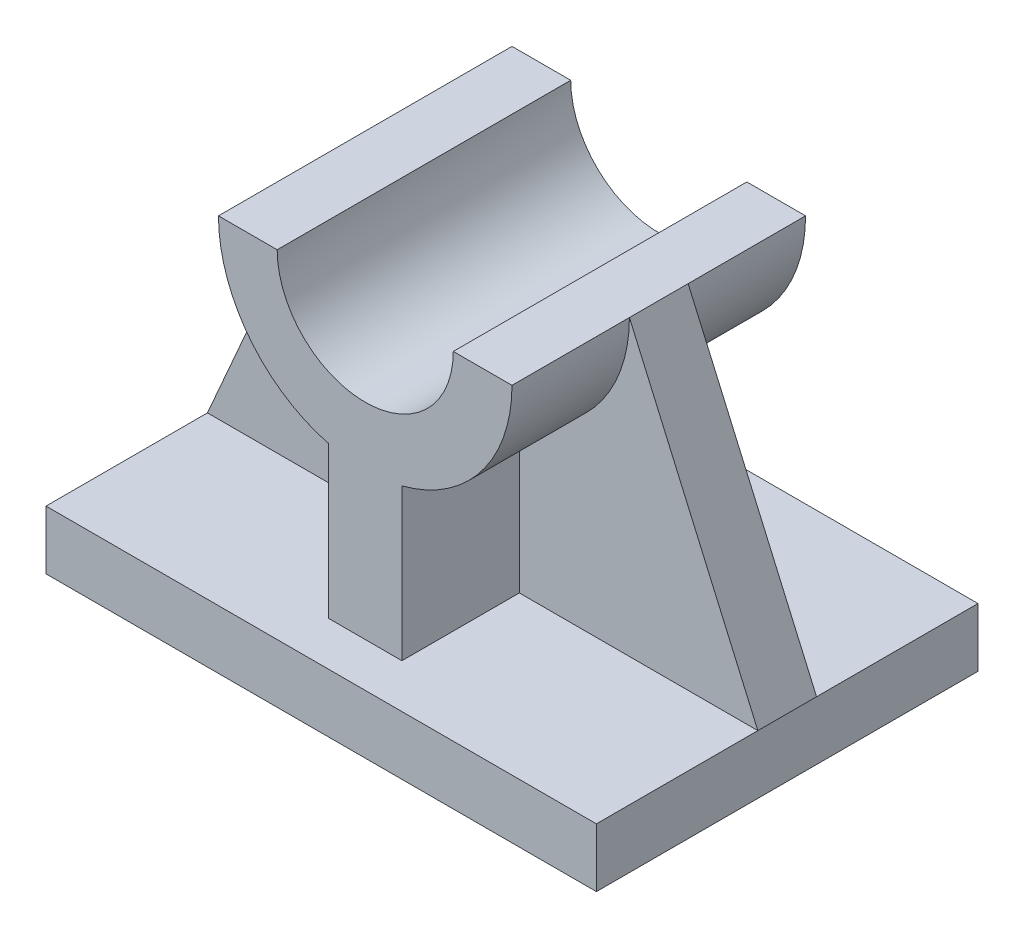
ISO-10303-21;
HEADER;
FILE_DESCRIPTION(('STEP AP214'),'2;1');
FILE_NAME('part.step','',(''),(''),'','','');
FILE_SCHEMA(('AUTOMOTIVE_DESIGN { 1 0 10303 214 1 1 1 1 }'));
ENDSEC;
DATA;
#1=APPLICATION_CONTEXT('core data for automotive mechanical design processes');
#2=APPLICATION_PROTOCOL_DEFINITION('international standard','automotive_design',2000,#1);
#3=PRODUCT_CONTEXT('',#1,'mechanical');
#4=PRODUCT('Part','Part','',(#3));
#5=PRODUCT_RELATED_PRODUCT_CATEGORY('part','',(#4));
#6=PRODUCT_DEFINITION_FORMATION('','',#4);
#7=PRODUCT_DEFINITION_CONTEXT('part definition',#1,'design');
#8=PRODUCT_DEFINITION('design','',#6,#7);
#9=PRODUCT_DEFINITION_SHAPE('','',#8);
#10=(LENGTH_UNIT() NAMED_UNIT(*) SI_UNIT(.MILLI.,.METRE.));
#11=(NAMED_UNIT(*) PLANE_ANGLE_UNIT() SI_UNIT($,.RADIAN.));
#12=(NAMED_UNIT(*) SI_UNIT($,.STERADIAN.) SOLID_ANGLE_UNIT());
#13=UNCERTAINTY_MEASURE_WITH_UNIT(LENGTH_MEASURE(1.E-05),#10,'distance_accuracy_value','');
#14=(GEOMETRIC_REPRESENTATION_CONTEXT(3) GLOBAL_UNCERTAINTY_ASSIGNED_CONTEXT((#13)) GLOBAL_UNIT_ASSIGNED_CONTEXT((#10,
#11,#12)) REPRESENTATION_CONTEXT('',''));
#15=CARTESIAN_POINT('',(0.,0.,0.));
#16=DIRECTION('',(0.,0.,1.));
#17=DIRECTION('',(1.,0.,0.));
#18=AXIS2_PLACEMENT_3D('',#15,#16,#17);
#19=CARTESIAN_POINT('',(0.,-40.,26.));
#20=DIRECTION('',(0.,1.,0.));
#21=DIRECTION('',(-1.,0.,0.));
#22=AXIS2_PLACEMENT_3D('',#19,#20,#21);
#23=PLANE('',#22);
#24=DIRECTION('',(0.,0.,-1.));
#25=VECTOR('',#24,1.);
#26=CARTESIAN_POINT('',(5.00000000000001,-40.,20.));
#27=LINE('',#26,#25);
#28=CARTESIAN_POINT('',(5.00000000000001,-40.,-4.));
#29=VERTEX_POINT('',#28);
#30=CARTESIAN_POINT('',(5.,-40.,-20.));
#31=VERTEX_POINT('',#30);
#32=EDGE_CURVE('E311',#29,#31,#27,.T.);
#33=ORIENTED_EDGE('',*,*,#32,.F.);
#34=DIRECTION('',(1.,0.,0.));
#35=VECTOR('',#34,1.);
#36=CARTESIAN_POINT('',(0.,-40.,-4.));
#37=LINE('',#36,#35);
#38=CARTESIAN_POINT('',(37.5,-40.,-4.));
#39=VERTEX_POINT('',#38);
#40=EDGE_CURVE('E247',#29,#39,#37,.T.);
#41=ORIENTED_EDGE('',*,*,#40,.T.);
#42=DIRECTION('',(0.,0.,-1.));
#43=VECTOR('',#42,1.);
#44=CARTESIAN_POINT('',(37.5,-40.,26.));
#45=LINE('',#44,#43);
#46=CARTESIAN_POINT('',(37.5,-40.,-26.));
#47=VERTEX_POINT('',#46);
#48=EDGE_CURVE('E43',#39,#47,#45,.T.);
#49=ORIENTED_EDGE('',*,*,#48,.T.);
#50=DIRECTION('',(1.,0.,0.));
#51=VECTOR('',#50,1.);
#52=CARTESIAN_POINT('',(0.,-40.,-26.));
#53=LINE('',#52,#51);
#54=CARTESIAN_POINT('',(-37.5,-40.,-26.));
#55=VERTEX_POINT('',#54);
#56=EDGE_CURVE('E202',#55,#47,#53,.T.);
#57=ORIENTED_EDGE('',*,*,#56,.F.);
#58=DIRECTION('',(0.,0.,-1.));
#59=VECTOR('',#58,1.);
#60=CARTESIAN_POINT('',(-37.5,-40.,26.));
#61=LINE('',#60,#59);
#62=CARTESIAN_POINT('',(-37.5,-40.,-3.99999999999999));
#63=VERTEX_POINT('',#62);
#64=EDGE_CURVE('E58',#63,#55,#61,.T.);
#65=ORIENTED_EDGE('',*,*,#64,.F.);
#66=DIRECTION('',(1.,0.,0.));
#67=VECTOR('',#66,1.);
#68=CARTESIAN_POINT('',(0.,-40.,-4.));
#69=LINE('',#68,#67);
#70=CARTESIAN_POINT('',(-5.,-40.,-4.));
#71=VERTEX_POINT('',#70);
#72=EDGE_CURVE('E282',#63,#71,#69,.T.);
#73=ORIENTED_EDGE('',*,*,#72,.T.);
#74=DIRECTION('',(0.,0.,-1.));
#75=VECTOR('',#74,1.);
#76=CARTESIAN_POINT('',(-5.,-40.,20.));
#77=LINE('',#76,#75);
#78=CARTESIAN_POINT('',(-5.,-40.,-20.));
#79=VERTEX_POINT('',#78);
#80=EDGE_CURVE('E335',#71,#79,#77,.T.);
#81=ORIENTED_EDGE('',*,*,#80,.T.);
#82=DIRECTION('',(1.,0.,0.));
#83=VECTOR('',#82,1.);
#84=CARTESIAN_POINT('',(0.,-40.,-20.));
#85=LINE('',#84,#83);
#86=EDGE_CURVE('E294',#79,#31,#85,.T.);
#87=ORIENTED_EDGE('',*,*,#86,.T.);
#88=EDGE_LOOP('',(#33,#41,#49,#57,#65,#73,#81,#87));
#89=FACE_BOUND('',#88,.T.);
#90=ADVANCED_FACE('F35',(#89),#23,.T.);
#91=CARTESIAN_POINT('',(5.,0.,20.));
#92=DIRECTION('',(1.,0.,0.));
#93=DIRECTION('',(0.,1.,0.));
#94=AXIS2_PLACEMENT_3D('',#91,#92,#93);
#95=PLANE('',#94);
#96=DIRECTION('',(0.,0.,-1.));
#97=VECTOR('',#96,1.);
#98=CARTESIAN_POINT('',(5.,-19.3649167310371,20.));
#99=LINE('',#98,#97);
#100=CARTESIAN_POINT('',(5.,-19.3649167310371,-4.));
#101=VERTEX_POINT('',#100);
#102=CARTESIAN_POINT('',(5.,-19.3649167310371,-20.));
#103=VERTEX_POINT('',#102);
#104=EDGE_CURVE('E199',#101,#103,#99,.T.);
#105=ORIENTED_EDGE('',*,*,#104,.F.);
#106=DIRECTION('',(0.,-1.,0.));
#107=VECTOR('',#106,1.);
#108=CARTESIAN_POINT('',(5.,0.,-4.));
#109=LINE('',#108,#107);
#110=EDGE_CURVE('E379',#101,#29,#109,.T.);
#111=ORIENTED_EDGE('',*,*,#110,.T.);
#112=ORIENTED_EDGE('',*,*,#32,.T.);
#113=DIRECTION('',(0.,-1.,0.));
#114=VECTOR('',#113,1.);
#115=CARTESIAN_POINT('',(5.,0.,-20.));
#116=LINE('',#115,#114);
#117=EDGE_CURVE('E291',#103,#31,#116,.T.);
#118=ORIENTED_EDGE('',*,*,#117,.F.);
#119=EDGE_LOOP('',(#105,#111,#112,#118));
#120=FACE_BOUND('',#119,.T.);
#121=ADVANCED_FACE('F412',(#120),#95,.T.);
#122=CARTESIAN_POINT('',(0.,0.,20.));
#123=DIRECTION('',(0.,0.,-1.));
#124=DIRECTION('',(-1.,0.,0.));
#125=AXIS2_PLACEMENT_3D('',#122,#123,#124);
#126=CYLINDRICAL_SURFACE('',#125,20.);
#127=CARTESIAN_POINT('',(0.,0.,-4.));
#128=DIRECTION('',(0.,0.,1.));
#129=DIRECTION('',(1.,0.,0.));
#130=AXIS2_PLACEMENT_3D('',#127,#128,#129);
#131=CIRCLE('',#130,20.);
#132=CARTESIAN_POINT('',(20.,0.,-4.));
#133=VERTEX_POINT('',#132);
#134=EDGE_CURVE('E377',#101,#133,#131,.T.);
#135=ORIENTED_EDGE('',*,*,#134,.F.);
#136=ORIENTED_EDGE('',*,*,#104,.T.);
#137=CARTESIAN_POINT('',(0.,0.,-20.));
#138=DIRECTION('',(0.,0.,1.));
#139=DIRECTION('',(1.,0.,0.));
#140=AXIS2_PLACEMENT_3D('',#137,#138,#139);
#141=CIRCLE('',#140,20.);
#142=CARTESIAN_POINT('',(20.,0.,-20.));
#143=VERTEX_POINT('',#142);
#144=EDGE_CURVE('E314',#103,#143,#141,.T.);
#145=ORIENTED_EDGE('',*,*,#144,.T.);
#146=DIRECTION('',(0.,0.,-1.));
#147=VECTOR('',#146,1.);
#148=CARTESIAN_POINT('',(20.,0.,20.));
#149=LINE('',#148,#147);
#150=EDGE_CURVE('E347',#133,#143,#149,.T.);
#151=ORIENTED_EDGE('',*,*,#150,.F.);
#152=EDGE_LOOP('',(#135,#136,#145,#151));
#153=FACE_BOUND('',#152,.T.);
#154=ADVANCED_FACE('F391',(#153),#126,.T.);
#155=CARTESIAN_POINT('',(0.,0.,20.));
#156=DIRECTION('',(0.,0.,-1.));
#157=DIRECTION('',(-1.,0.,0.));
#158=AXIS2_PLACEMENT_3D('',#155,#156,#157);
#159=CYLINDRICAL_SURFACE('',#158,20.);
#160=CARTESIAN_POINT('',(0.,0.,-4.));
#161=DIRECTION('',(0.,0.,1.));
#162=DIRECTION('',(1.,0.,0.));
#163=AXIS2_PLACEMENT_3D('',#160,#161,#162);
#164=CIRCLE('',#163,20.);
#165=CARTESIAN_POINT('',(-20.,0.,-4.));
#166=VERTEX_POINT('',#165);
#167=CARTESIAN_POINT('',(-5.,-19.3649167310371,-4.));
#168=VERTEX_POINT('',#167);
#169=EDGE_CURVE('E276',#166,#168,#164,.T.);
#170=ORIENTED_EDGE('',*,*,#169,.F.);
#171=DIRECTION('',(0.,0.,-1.));
#172=VECTOR('',#171,1.);
#173=CARTESIAN_POINT('',(-20.,0.,20.));
#174=LINE('',#173,#172);
#175=CARTESIAN_POINT('',(-20.,0.,-20.));
#176=VERTEX_POINT('',#175);
#177=EDGE_CURVE('E341',#166,#176,#174,.T.);
#178=ORIENTED_EDGE('',*,*,#177,.T.);
#179=CARTESIAN_POINT('',(0.,0.,-20.));
#180=DIRECTION('',(0.,0.,1.));
#181=DIRECTION('',(1.,0.,0.));
#182=AXIS2_PLACEMENT_3D('',#179,#180,#181);
#183=CIRCLE('',#182,20.);
#184=CARTESIAN_POINT('',(-5.,-19.3649167310371,-20.));
#185=VERTEX_POINT('',#184);
#186=EDGE_CURVE('E326',#176,#185,#183,.T.);
#187=ORIENTED_EDGE('',*,*,#186,.T.);
#188=DIRECTION('',(0.,0.,-1.));
#189=VECTOR('',#188,1.);
#190=CARTESIAN_POINT('',(-5.,-19.3649167310371,20.));
#191=LINE('',#190,#189);
#192=EDGE_CURVE('E337',#168,#185,#191,.T.);
#193=ORIENTED_EDGE('',*,*,#192,.F.);
#194=EDGE_LOOP('',(#170,#178,#187,#193));
#195=FACE_BOUND('',#194,.T.);
#196=ADVANCED_FACE('F401',(#195),#159,.T.);
#197=CARTESIAN_POINT('',(-5.,0.,20.));
#198=DIRECTION('',(1.,0.,0.));
#199=DIRECTION('',(0.,1.,0.));
#200=AXIS2_PLACEMENT_3D('',#197,#198,#199);
#201=PLANE('',#200);
#202=DIRECTION('',(0.,-1.,0.));
#203=VECTOR('',#202,1.);
#204=CARTESIAN_POINT('',(-5.,0.,-4.));
#205=LINE('',#204,#203);
#206=EDGE_CURVE('E284',#168,#71,#205,.T.);
#207=ORIENTED_EDGE('',*,*,#206,.F.);
#208=ORIENTED_EDGE('',*,*,#192,.T.);
#209=DIRECTION('',(0.,-1.,0.));
#210=VECTOR('',#209,1.);
#211=CARTESIAN_POINT('',(-5.,0.,-20.));
#212=LINE('',#211,#210);
#213=EDGE_CURVE('E329',#185,#79,#212,.T.);
#214=ORIENTED_EDGE('',*,*,#213,.T.);
#215=ORIENTED_EDGE('',*,*,#80,.F.);
#216=EDGE_LOOP('',(#207,#208,#214,#215));
#217=FACE_BOUND('',#216,.T.);
#218=ADVANCED_FACE('F410',(#217),#201,.F.);
#219=CARTESIAN_POINT('',(37.5,0.,26.));
#220=DIRECTION('',(1.,0.,0.));
#221=DIRECTION('',(0.,0.,-1.));
#222=AXIS2_PLACEMENT_3D('',#219,#220,#221);
#223=PLANE('',#222);
#224=DIRECTION('',(0.,-1.,0.));
#225=VECTOR('',#224,1.);
#226=CARTESIAN_POINT('',(37.5,0.,-26.));
#227=LINE('',#226,#225);
#228=CARTESIAN_POINT('',(37.5,-48.,-26.));
#229=VERTEX_POINT('',#228);
#230=EDGE_CURVE('E198',#47,#229,#227,.T.);
#231=ORIENTED_EDGE('',*,*,#230,.F.);
#232=ORIENTED_EDGE('',*,*,#48,.F.);
#233=DIRECTION('',(0.,0.,-1.));
#234=VECTOR('',#233,1.);
#235=CARTESIAN_POINT('',(37.5,-40.,4.));
#236=LINE('',#235,#234);
#237=CARTESIAN_POINT('',(37.5,-40.,4.));
#238=VERTEX_POINT('',#237);
#239=EDGE_CURVE('E280',#238,#39,#236,.T.);
#240=ORIENTED_EDGE('',*,*,#239,.F.);
#241=CARTESIAN_POINT('',(37.5,-40.,26.));
#242=VERTEX_POINT('',#241);
#243=EDGE_CURVE('E11',#242,#238,#45,.T.);
#244=ORIENTED_EDGE('',*,*,#243,.F.);
#245=DIRECTION('',(0.,-1.,0.));
#246=VECTOR('',#245,1.);
#247=CARTESIAN_POINT('',(37.5,0.,26.));
#248=LINE('',#247,#246);
#249=CARTESIAN_POINT('',(37.5,-48.,26.));
#250=VERTEX_POINT('',#249);
#251=EDGE_CURVE('E208',#242,#250,#248,.T.);
#252=ORIENTED_EDGE('',*,*,#251,.T.);
#253=DIRECTION('',(0.,0.,-1.));
#254=VECTOR('',#253,1.);
#255=CARTESIAN_POINT('',(37.5,-48.,26.));
#256=LINE('',#255,#254);
#257=EDGE_CURVE('E218',#250,#229,#256,.T.);
#258=ORIENTED_EDGE('',*,*,#257,.T.);
#259=EDGE_LOOP('',(#231,#232,#240,#244,#252,#258));
#260=FACE_BOUND('',#259,.T.);
#261=ADVANCED_FACE('F37',(#260),#223,.T.);
#262=DIRECTION('',(1.,0.,0.));
#263=VECTOR('',#262,1.);
#264=CARTESIAN_POINT('',(0.,-40.,4.));
#265=LINE('',#264,#263);
#266=CARTESIAN_POINT('',(5.00000000000001,-40.,4.));
#267=VERTEX_POINT('',#266);
#268=EDGE_CURVE('E193',#267,#238,#265,.T.);
#269=ORIENTED_EDGE('',*,*,#268,.F.);
#270=CARTESIAN_POINT('',(5.00000000000001,-40.,20.));
#271=VERTEX_POINT('',#270);
#272=EDGE_CURVE('E192',#271,#267,#27,.T.);
#273=ORIENTED_EDGE('',*,*,#272,.F.);
#274=DIRECTION('',(1.,0.,0.));
#275=VECTOR('',#274,1.);
#276=CARTESIAN_POINT('',(0.,-40.,20.));
#277=LINE('',#276,#275);
#278=CARTESIAN_POINT('',(-5.,-40.,20.));
#279=VERTEX_POINT('',#278);
#280=EDGE_CURVE('E309',#279,#271,#277,.T.);
#281=ORIENTED_EDGE('',*,*,#280,.F.);
#282=CARTESIAN_POINT('',(-5.,-40.,4.));
#283=VERTEX_POINT('',#282);
#284=EDGE_CURVE('E265',#279,#283,#77,.T.);
#285=ORIENTED_EDGE('',*,*,#284,.T.);
#286=DIRECTION('',(1.,0.,0.));
#287=VECTOR('',#286,1.);
#288=CARTESIAN_POINT('',(0.,-40.,4.));
#289=LINE('',#288,#287);
#290=CARTESIAN_POINT('',(-37.5,-40.,4.00000000000001));
#291=VERTEX_POINT('',#290);
#292=EDGE_CURVE('E262',#291,#283,#289,.T.);
#293=ORIENTED_EDGE('',*,*,#292,.F.);
#294=CARTESIAN_POINT('',(-37.5,-40.,26.));
#295=VERTEX_POINT('',#294);
#296=EDGE_CURVE('E229',#295,#291,#61,.T.);
#297=ORIENTED_EDGE('',*,*,#296,.F.);
#298=DIRECTION('',(1.,0.,0.));
#299=VECTOR('',#298,1.);
#300=CARTESIAN_POINT('',(0.,-40.,26.));
#301=LINE('',#300,#299);
#302=EDGE_CURVE('E211',#295,#242,#301,.T.);
#303=ORIENTED_EDGE('',*,*,#302,.T.);
#304=ORIENTED_EDGE('',*,*,#243,.T.);
#305=EDGE_LOOP('',(#269,#273,#281,#285,#293,#297,#303,#304));
#306=FACE_BOUND('',#305,.T.);
#307=ADVANCED_FACE('F259',(#306),#23,.T.);
#308=CARTESIAN_POINT('',(-37.5,0.,26.));
#309=DIRECTION('',(1.,0.,0.));
#310=DIRECTION('',(0.,0.,-1.));
#311=AXIS2_PLACEMENT_3D('',#308,#309,#310);
#312=PLANE('',#311);
#313=DIRECTION('',(0.,-1.,0.));
#314=VECTOR('',#313,1.);
#315=CARTESIAN_POINT('',(-37.5,0.,-26.));
#316=LINE('',#315,#314);
#317=CARTESIAN_POINT('',(-37.5,-48.,-26.));
#318=VERTEX_POINT('',#317);
#319=EDGE_CURVE('E222',#55,#318,#316,.T.);
#320=ORIENTED_EDGE('',*,*,#319,.T.);
#321=DIRECTION('',(0.,0.,-1.));
#322=VECTOR('',#321,1.);
#323=CARTESIAN_POINT('',(-37.5,-48.,26.));
#324=LINE('',#323,#322);
#325=CARTESIAN_POINT('',(-37.5,-48.,26.));
#326=VERTEX_POINT('',#325);
#327=EDGE_CURVE('E227',#326,#318,#324,.T.);
#328=ORIENTED_EDGE('',*,*,#327,.F.);
#329=DIRECTION('',(0.,-1.,0.));
#330=VECTOR('',#329,1.);
#331=CARTESIAN_POINT('',(-37.5,0.,26.));
#332=LINE('',#331,#330);
#333=EDGE_CURVE('E215',#295,#326,#332,.T.);
#334=ORIENTED_EDGE('',*,*,#333,.F.);
#335=ORIENTED_EDGE('',*,*,#296,.T.);
#336=DIRECTION('',(0.,0.,-1.));
#337=VECTOR('',#336,1.);
#338=CARTESIAN_POINT('',(-37.5,-40.,4.));
#339=LINE('',#338,#337);
#340=EDGE_CURVE('E238',#291,#63,#339,.T.);
#341=ORIENTED_EDGE('',*,*,#340,.T.);
#342=ORIENTED_EDGE('',*,*,#64,.T.);
#343=EDGE_LOOP('',(#320,#328,#334,#335,#341,#342));
#344=FACE_BOUND('',#343,.T.);
#345=ADVANCED_FACE('F235',(#344),#312,.F.);
#346=CARTESIAN_POINT('',(0.,-48.,26.));
#347=DIRECTION('',(0.,1.,0.));
#348=DIRECTION('',(-1.,0.,0.));
#349=AXIS2_PLACEMENT_3D('',#346,#347,#348);
#350=PLANE('',#349);
#351=DIRECTION('',(1.,0.,0.));
#352=VECTOR('',#351,1.);
#353=CARTESIAN_POINT('',(0.,-48.,-26.));
#354=LINE('',#353,#352);
#355=EDGE_CURVE('E212',#318,#229,#354,.T.);
#356=ORIENTED_EDGE('',*,*,#355,.T.);
#357=ORIENTED_EDGE('',*,*,#257,.F.);
#358=DIRECTION('',(1.,0.,0.));
#359=VECTOR('',#358,1.);
#360=CARTESIAN_POINT('',(0.,-48.,26.));
#361=LINE('',#360,#359);
#362=EDGE_CURVE('E217',#326,#250,#361,.T.);
#363=ORIENTED_EDGE('',*,*,#362,.F.);
#364=ORIENTED_EDGE('',*,*,#327,.T.);
#365=EDGE_LOOP('',(#356,#357,#363,#364));
#366=FACE_BOUND('',#365,.T.);
#367=ADVANCED_FACE('F254',(#366),#350,.F.);
#368=CARTESIAN_POINT('',(0.,0.,26.));
#369=DIRECTION('',(0.,0.,1.));
#370=DIRECTION('',(1.,0.,0.));
#371=AXIS2_PLACEMENT_3D('',#368,#369,#370);
#372=PLANE('',#371);
#373=ORIENTED_EDGE('',*,*,#251,.F.);
#374=ORIENTED_EDGE('',*,*,#302,.F.);
#375=ORIENTED_EDGE('',*,*,#333,.T.);
#376=ORIENTED_EDGE('',*,*,#362,.T.);
#377=EDGE_LOOP('',(#373,#374,#375,#376));
#378=FACE_BOUND('',#377,.T.);
#379=ADVANCED_FACE('F257',(#378),#372,.T.);
#380=CARTESIAN_POINT('',(0.,0.,-26.));
#381=DIRECTION('',(0.,0.,1.));
#382=DIRECTION('',(1.,0.,0.));
#383=AXIS2_PLACEMENT_3D('',#380,#381,#382);
#384=PLANE('',#383);
#385=ORIENTED_EDGE('',*,*,#230,.T.);
#386=ORIENTED_EDGE('',*,*,#355,.F.);
#387=ORIENTED_EDGE('',*,*,#319,.F.);
#388=ORIENTED_EDGE('',*,*,#56,.T.);
#389=EDGE_LOOP('',(#385,#386,#387,#388));
#390=FACE_BOUND('',#389,.T.);
#391=ADVANCED_FACE('F242',(#390),#384,.F.);
#392=DIRECTION('',(0.,-1.,0.));
#393=VECTOR('',#392,1.);
#394=CARTESIAN_POINT('',(5.,0.,4.));
#395=LINE('',#394,#393);
#396=CARTESIAN_POINT('',(5.,-19.3649167310371,4.));
#397=VERTEX_POINT('',#396);
#398=EDGE_CURVE('E176',#397,#267,#395,.T.);
#399=ORIENTED_EDGE('',*,*,#398,.F.);
#400=CARTESIAN_POINT('',(5.,-19.3649167310371,20.));
#401=VERTEX_POINT('',#400);
#402=EDGE_CURVE('E189',#401,#397,#99,.T.);
#403=ORIENTED_EDGE('',*,*,#402,.F.);
#404=DIRECTION('',(0.,-1.,0.));
#405=VECTOR('',#404,1.);
#406=CARTESIAN_POINT('',(5.,0.,20.));
#407=LINE('',#406,#405);
#408=EDGE_CURVE('E292',#401,#271,#407,.T.);
#409=ORIENTED_EDGE('',*,*,#408,.T.);
#410=ORIENTED_EDGE('',*,*,#272,.T.);
#411=EDGE_LOOP('',(#399,#403,#409,#410));
#412=FACE_BOUND('',#411,.T.);
#413=ADVANCED_FACE('F187',(#412),#95,.T.);
#414=ORIENTED_EDGE('',*,*,#402,.T.);
#415=CARTESIAN_POINT('',(0.,0.,4.));
#416=DIRECTION('',(0.,0.,1.));
#417=DIRECTION('',(1.,0.,0.));
#418=AXIS2_PLACEMENT_3D('',#415,#416,#417);
#419=CIRCLE('',#418,20.);
#420=CARTESIAN_POINT('',(20.,0.,4.));
#421=VERTEX_POINT('',#420);
#422=EDGE_CURVE('E173',#397,#421,#419,.T.);
#423=ORIENTED_EDGE('',*,*,#422,.T.);
#424=CARTESIAN_POINT('',(20.,0.,20.));
#425=VERTEX_POINT('',#424);
#426=EDGE_CURVE('E204',#425,#421,#149,.T.);
#427=ORIENTED_EDGE('',*,*,#426,.F.);
#428=CARTESIAN_POINT('',(0.,0.,20.));
#429=DIRECTION('',(0.,0.,1.));
#430=DIRECTION('',(1.,0.,0.));
#431=AXIS2_PLACEMENT_3D('',#428,#429,#430);
#432=CIRCLE('',#431,20.);
#433=EDGE_CURVE('E196',#401,#425,#432,.T.);
#434=ORIENTED_EDGE('',*,*,#433,.F.);
#435=EDGE_LOOP('',(#414,#423,#427,#434));
#436=FACE_BOUND('',#435,.T.);
#437=ADVANCED_FACE('F195',(#436),#126,.T.);
#438=CARTESIAN_POINT('',(0.,0.,20.));
#439=DIRECTION('',(0.,1.,0.));
#440=DIRECTION('',(0.,0.,1.));
#441=AXIS2_PLACEMENT_3D('',#438,#439,#440);
#442=PLANE('',#441);
#443=DIRECTION('',(1.,0.,0.));
#444=VECTOR('',#443,1.);
#445=CARTESIAN_POINT('',(0.,0.,-20.));
#446=LINE('',#445,#444);
#447=CARTESIAN_POINT('',(12.,0.,-20.));
#448=VERTEX_POINT('',#447);
#449=EDGE_CURVE('E317',#448,#143,#446,.T.);
#450=ORIENTED_EDGE('',*,*,#449,.F.);
#451=DIRECTION('',(0.,0.,-1.));
#452=VECTOR('',#451,1.);
#453=CARTESIAN_POINT('',(12.,0.,20.));
#454=LINE('',#453,#452);
#455=CARTESIAN_POINT('',(12.,0.,20.));
#456=VERTEX_POINT('',#455);
#457=EDGE_CURVE('E346',#456,#448,#454,.T.);
#458=ORIENTED_EDGE('',*,*,#457,.F.);
#459=DIRECTION('',(1.,0.,0.));
#460=VECTOR('',#459,1.);
#461=CARTESIAN_POINT('',(0.,0.,20.));
#462=LINE('',#461,#460);
#463=EDGE_CURVE('E296',#456,#425,#462,.T.);
#464=ORIENTED_EDGE('',*,*,#463,.T.);
#465=ORIENTED_EDGE('',*,*,#426,.T.);
#466=DIRECTION('',(0.,0.,-1.));
#467=VECTOR('',#466,1.);
#468=CARTESIAN_POINT('',(20.,0.,4.));
#469=LINE('',#468,#467);
#470=EDGE_CURVE('E355',#421,#133,#469,.T.);
#471=ORIENTED_EDGE('',*,*,#470,.T.);
#472=ORIENTED_EDGE('',*,*,#150,.T.);
#473=EDGE_LOOP('',(#450,#458,#464,#465,#471,#472));
#474=FACE_BOUND('',#473,.T.);
#475=ADVANCED_FACE('F354',(#474),#442,.T.);
#476=CARTESIAN_POINT('',(0.,0.,20.));
#477=DIRECTION('',(0.,0.,-1.));
#478=DIRECTION('',(-1.,0.,0.));
#479=AXIS2_PLACEMENT_3D('',#476,#477,#478);
#480=CYLINDRICAL_SURFACE('',#479,12.);
#481=CARTESIAN_POINT('',(0.,0.,-20.));
#482=DIRECTION('',(0.,0.,1.));
#483=DIRECTION('',(1.,0.,0.));
#484=AXIS2_PLACEMENT_3D('',#481,#482,#483);
#485=CIRCLE('',#484,12.);
#486=CARTESIAN_POINT('',(-12.,0.,-20.));
#487=VERTEX_POINT('',#486);
#488=EDGE_CURVE('E320',#487,#448,#485,.T.);
#489=ORIENTED_EDGE('',*,*,#488,.F.);
#490=DIRECTION('',(0.,0.,-1.));
#491=VECTOR('',#490,1.);
#492=CARTESIAN_POINT('',(-12.,0.,20.));
#493=LINE('',#492,#491);
#494=CARTESIAN_POINT('',(-12.,0.,20.));
#495=VERTEX_POINT('',#494);
#496=EDGE_CURVE('E345',#495,#487,#493,.T.);
#497=ORIENTED_EDGE('',*,*,#496,.F.);
#498=CARTESIAN_POINT('',(0.,0.,20.));
#499=DIRECTION('',(0.,0.,1.));
#500=DIRECTION('',(1.,0.,0.));
#501=AXIS2_PLACEMENT_3D('',#498,#499,#500);
#502=CIRCLE('',#501,12.);
#503=EDGE_CURVE('E299',#495,#456,#502,.T.);
#504=ORIENTED_EDGE('',*,*,#503,.T.);
#505=ORIENTED_EDGE('',*,*,#457,.T.);
#506=EDGE_LOOP('',(#489,#497,#504,#505));
#507=FACE_BOUND('',#506,.T.);
#508=ADVANCED_FACE('F361',(#507),#480,.F.);
#509=CARTESIAN_POINT('',(0.,0.,20.));
#510=DIRECTION('',(0.,1.,0.));
#511=DIRECTION('',(0.,0.,1.));
#512=AXIS2_PLACEMENT_3D('',#509,#510,#511);
#513=PLANE('',#512);
#514=DIRECTION('',(1.,0.,0.));
#515=VECTOR('',#514,1.);
#516=CARTESIAN_POINT('',(0.,0.,-20.));
#517=LINE('',#516,#515);
#518=EDGE_CURVE('E323',#176,#487,#517,.T.);
#519=ORIENTED_EDGE('',*,*,#518,.F.);
#520=ORIENTED_EDGE('',*,*,#177,.F.);
#521=DIRECTION('',(0.,0.,-1.));
#522=VECTOR('',#521,1.);
#523=CARTESIAN_POINT('',(-20.,0.,4.));
#524=LINE('',#523,#522);
#525=CARTESIAN_POINT('',(-20.,0.,4.));
#526=VERTEX_POINT('',#525);
#527=EDGE_CURVE('E288',#526,#166,#524,.T.);
#528=ORIENTED_EDGE('',*,*,#527,.F.);
#529=CARTESIAN_POINT('',(-20.,0.,20.));
#530=VERTEX_POINT('',#529);
#531=EDGE_CURVE('E342',#530,#526,#174,.T.);
#532=ORIENTED_EDGE('',*,*,#531,.F.);
#533=DIRECTION('',(1.,0.,0.));
#534=VECTOR('',#533,1.);
#535=CARTESIAN_POINT('',(0.,0.,20.));
#536=LINE('',#535,#534);
#537=EDGE_CURVE('E302',#530,#495,#536,.T.);
#538=ORIENTED_EDGE('',*,*,#537,.T.);
#539=ORIENTED_EDGE('',*,*,#496,.T.);
#540=EDGE_LOOP('',(#519,#520,#528,#532,#538,#539));
#541=FACE_BOUND('',#540,.T.);
#542=ADVANCED_FACE('F364',(#541),#513,.T.);
#543=ORIENTED_EDGE('',*,*,#531,.T.);
#544=CARTESIAN_POINT('',(0.,0.,4.));
#545=DIRECTION('',(0.,0.,1.));
#546=DIRECTION('',(1.,0.,0.));
#547=AXIS2_PLACEMENT_3D('',#544,#545,#546);
#548=CIRCLE('',#547,20.);
#549=CARTESIAN_POINT('',(-5.,-19.3649167310371,4.));
#550=VERTEX_POINT('',#549);
#551=EDGE_CURVE('E272',#526,#550,#548,.T.);
#552=ORIENTED_EDGE('',*,*,#551,.T.);
#553=CARTESIAN_POINT('',(-5.,-19.3649167310371,20.));
#554=VERTEX_POINT('',#553);
#555=EDGE_CURVE('E338',#554,#550,#191,.T.);
#556=ORIENTED_EDGE('',*,*,#555,.F.);
#557=CARTESIAN_POINT('',(0.,0.,20.));
#558=DIRECTION('',(0.,0.,1.));
#559=DIRECTION('',(1.,0.,0.));
#560=AXIS2_PLACEMENT_3D('',#557,#558,#559);
#561=CIRCLE('',#560,20.);
#562=EDGE_CURVE('E305',#530,#554,#561,.T.);
#563=ORIENTED_EDGE('',*,*,#562,.F.);
#564=EDGE_LOOP('',(#543,#552,#556,#563));
#565=FACE_BOUND('',#564,.T.);
#566=ADVANCED_FACE('F370',(#565),#159,.T.);
#567=ORIENTED_EDGE('',*,*,#555,.T.);
#568=DIRECTION('',(0.,-1.,0.));
#569=VECTOR('',#568,1.);
#570=CARTESIAN_POINT('',(-5.,0.,4.));
#571=LINE('',#570,#569);
#572=EDGE_CURVE('E268',#550,#283,#571,.T.);
#573=ORIENTED_EDGE('',*,*,#572,.T.);
#574=ORIENTED_EDGE('',*,*,#284,.F.);
#575=DIRECTION('',(0.,-1.,0.));
#576=VECTOR('',#575,1.);
#577=CARTESIAN_POINT('',(-5.,0.,20.));
#578=LINE('',#577,#576);
#579=EDGE_CURVE('E307',#554,#279,#578,.T.);
#580=ORIENTED_EDGE('',*,*,#579,.F.);
#581=EDGE_LOOP('',(#567,#573,#574,#580));
#582=FACE_BOUND('',#581,.T.);
#583=ADVANCED_FACE('F373',(#582),#201,.F.);
#584=CARTESIAN_POINT('',(0.,0.,20.));
#585=DIRECTION('',(0.,0.,1.));
#586=DIRECTION('',(1.,0.,0.));
#587=AXIS2_PLACEMENT_3D('',#584,#585,#586);
#588=PLANE('',#587);
#589=ORIENTED_EDGE('',*,*,#408,.F.);
#590=ORIENTED_EDGE('',*,*,#433,.T.);
#591=ORIENTED_EDGE('',*,*,#463,.F.);
#592=ORIENTED_EDGE('',*,*,#503,.F.);
#593=ORIENTED_EDGE('',*,*,#537,.F.);
#594=ORIENTED_EDGE('',*,*,#562,.T.);
#595=ORIENTED_EDGE('',*,*,#579,.T.);
#596=ORIENTED_EDGE('',*,*,#280,.T.);
#597=EDGE_LOOP('',(#589,#590,#591,#592,#593,#594,#595,#596));
#598=FACE_BOUND('',#597,.T.);
#599=ADVANCED_FACE('F359',(#598),#588,.T.);
#600=CARTESIAN_POINT('',(0.,0.,-20.));
#601=DIRECTION('',(0.,0.,1.));
#602=DIRECTION('',(1.,0.,0.));
#603=AXIS2_PLACEMENT_3D('',#600,#601,#602);
#604=PLANE('',#603);
#605=ORIENTED_EDGE('',*,*,#117,.T.);
#606=ORIENTED_EDGE('',*,*,#86,.F.);
#607=ORIENTED_EDGE('',*,*,#213,.F.);
#608=ORIENTED_EDGE('',*,*,#186,.F.);
#609=ORIENTED_EDGE('',*,*,#518,.T.);
#610=ORIENTED_EDGE('',*,*,#488,.T.);
#611=ORIENTED_EDGE('',*,*,#449,.T.);
#612=ORIENTED_EDGE('',*,*,#144,.F.);
#613=EDGE_LOOP('',(#605,#606,#607,#608,#609,#610,#611,#612));
#614=FACE_BOUND('',#613,.T.);
#615=ADVANCED_FACE('F395',(#614),#604,.F.);
#616=CARTESIAN_POINT('',(-16.7868852459016,7.34426229508196,4.));
#617=DIRECTION('',(0.916157334902189,-0.400818834019708,0.));
#618=DIRECTION('',(0.400818834019708,0.916157334902189,0.));
#619=AXIS2_PLACEMENT_3D('',#616,#617,#618);
#620=PLANE('',#619);
#621=DIRECTION('',(-0.400818834019708,-0.916157334902189,0.));
#622=VECTOR('',#621,1.);
#623=CARTESIAN_POINT('',(-16.7868852459016,7.34426229508196,-4.));
#624=LINE('',#623,#622);
#625=EDGE_CURVE('E279',#166,#63,#624,.T.);
#626=ORIENTED_EDGE('',*,*,#625,.T.);
#627=ORIENTED_EDGE('',*,*,#340,.F.);
#628=DIRECTION('',(-0.400818834019708,-0.916157334902189,0.));
#629=VECTOR('',#628,1.);
#630=CARTESIAN_POINT('',(-16.7868852459016,7.34426229508196,4.));
#631=LINE('',#630,#629);
#632=EDGE_CURVE('E269',#526,#291,#631,.T.);
#633=ORIENTED_EDGE('',*,*,#632,.F.);
#634=ORIENTED_EDGE('',*,*,#527,.T.);
#635=EDGE_LOOP('',(#626,#627,#633,#634));
#636=FACE_BOUND('',#635,.T.);
#637=ADVANCED_FACE('F405',(#636),#620,.F.);
#638=CARTESIAN_POINT('',(0.,0.,4.));
#639=DIRECTION('',(0.,0.,1.));
#640=DIRECTION('',(1.,0.,0.));
#641=AXIS2_PLACEMENT_3D('',#638,#639,#640);
#642=PLANE('',#641);
#643=ORIENTED_EDGE('',*,*,#551,.F.);
#644=ORIENTED_EDGE('',*,*,#632,.T.);
#645=ORIENTED_EDGE('',*,*,#292,.T.);
#646=ORIENTED_EDGE('',*,*,#572,.F.);
#647=EDGE_LOOP('',(#643,#644,#645,#646));
#648=FACE_BOUND('',#647,.T.);
#649=ADVANCED_FACE('F492',(#648),#642,.T.);
#650=CARTESIAN_POINT('',(0.,0.,-4.));
#651=DIRECTION('',(0.,0.,1.));
#652=DIRECTION('',(1.,0.,0.));
#653=AXIS2_PLACEMENT_3D('',#650,#651,#652);
#654=PLANE('',#653);
#655=ORIENTED_EDGE('',*,*,#169,.T.);
#656=ORIENTED_EDGE('',*,*,#206,.T.);
#657=ORIENTED_EDGE('',*,*,#72,.F.);
#658=ORIENTED_EDGE('',*,*,#625,.F.);
#659=EDGE_LOOP('',(#655,#656,#657,#658));
#660=FACE_BOUND('',#659,.T.);
#661=ADVANCED_FACE('F408',(#660),#654,.F.);
#662=CARTESIAN_POINT('',(16.7868852459016,7.34426229508197,4.));
#663=DIRECTION('',(0.916157334902189,0.400818834019708,0.));
#664=DIRECTION('',(-0.400818834019708,0.916157334902189,0.));
#665=AXIS2_PLACEMENT_3D('',#662,#663,#664);
#666=PLANE('',#665);
#667=DIRECTION('',(0.400818834019708,-0.916157334902189,0.));
#668=VECTOR('',#667,1.);
#669=CARTESIAN_POINT('',(16.7868852459016,7.34426229508197,-4.));
#670=LINE('',#669,#668);
#671=EDGE_CURVE('E50',#133,#39,#670,.T.);
#672=ORIENTED_EDGE('',*,*,#671,.F.);
#673=ORIENTED_EDGE('',*,*,#470,.F.);
#674=DIRECTION('',(0.400818834019708,-0.916157334902189,0.));
#675=VECTOR('',#674,1.);
#676=CARTESIAN_POINT('',(16.7868852459016,7.34426229508197,4.));
#677=LINE('',#676,#675);
#678=EDGE_CURVE('E179',#421,#238,#677,.T.);
#679=ORIENTED_EDGE('',*,*,#678,.T.);
#680=ORIENTED_EDGE('',*,*,#239,.T.);
#681=EDGE_LOOP('',(#672,#673,#679,#680));
#682=FACE_BOUND('',#681,.T.);
#683=ADVANCED_FACE('F385',(#682),#666,.T.);
#684=CARTESIAN_POINT('',(0.,0.,4.));
#685=DIRECTION('',(0.,0.,1.));
#686=DIRECTION('',(1.,0.,0.));
#687=AXIS2_PLACEMENT_3D('',#684,#685,#686);
#688=PLANE('',#687);
#689=ORIENTED_EDGE('',*,*,#422,.F.);
#690=ORIENTED_EDGE('',*,*,#398,.T.);
#691=ORIENTED_EDGE('',*,*,#268,.T.);
#692=ORIENTED_EDGE('',*,*,#678,.F.);
#693=EDGE_LOOP('',(#689,#690,#691,#692));
#694=FACE_BOUND('',#693,.T.);
#695=ADVANCED_FACE('F175',(#694),#688,.T.);
#696=CARTESIAN_POINT('',(0.,0.,-4.));
#697=DIRECTION('',(0.,0.,1.));
#698=DIRECTION('',(1.,0.,0.));
#699=AXIS2_PLACEMENT_3D('',#696,#697,#698);
#700=PLANE('',#699);
#701=ORIENTED_EDGE('',*,*,#134,.T.);
#702=ORIENTED_EDGE('',*,*,#671,.T.);
#703=ORIENTED_EDGE('',*,*,#40,.F.);
#704=ORIENTED_EDGE('',*,*,#110,.F.);
#705=EDGE_LOOP('',(#701,#702,#703,#704));
#706=FACE_BOUND('',#705,.T.);
#707=ADVANCED_FACE('F387',(#706),#700,.F.);
#708=CLOSED_SHELL('',(#90,#121,#154,#196,#218,#261,#307,#345,#367,#379,#391,#413,#437,#475,#508,
#542,#566,#583,#599,#615,#637,#649,#661,#683,#695,#707));
#709=MANIFOLD_SOLID_BREP('B2',#708);
#710=ADVANCED_BREP_SHAPE_REPRESENTATION('',(#18,#709),#14);
#711=SHAPE_DEFINITION_REPRESENTATION(#9,#710);
ENDSEC;
END-ISO-10303-21;
